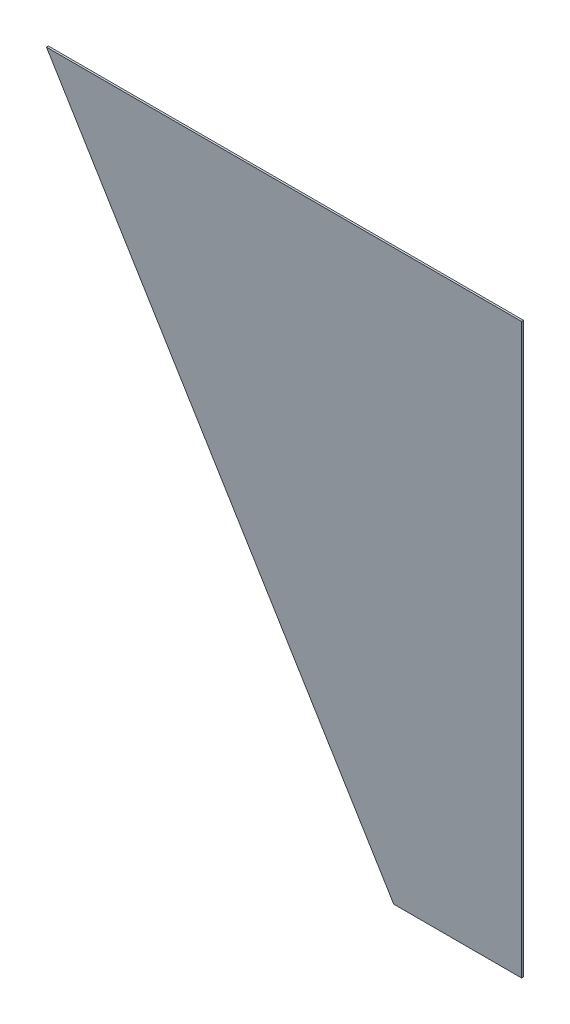
ISO-10303-21;
HEADER;
FILE_DESCRIPTION(('STEP AP214'),'2;1');
FILE_NAME('part.step','',(''),(''),'','','');
FILE_SCHEMA(('AUTOMOTIVE_DESIGN { 1 0 10303 214 1 1 1 1 }'));
ENDSEC;
DATA;
#1=APPLICATION_CONTEXT('core data for automotive mechanical design processes');
#2=APPLICATION_PROTOCOL_DEFINITION('international standard','automotive_design',2000,#1);
#3=PRODUCT_CONTEXT('',#1,'mechanical');
#4=PRODUCT('Part','Part','',(#3));
#5=PRODUCT_RELATED_PRODUCT_CATEGORY('part','',(#4));
#6=PRODUCT_DEFINITION_FORMATION('','',#4);
#7=PRODUCT_DEFINITION_CONTEXT('part definition',#1,'design');
#8=PRODUCT_DEFINITION('design','',#6,#7);
#9=PRODUCT_DEFINITION_SHAPE('','',#8);
#10=(LENGTH_UNIT() NAMED_UNIT(*) SI_UNIT(.MILLI.,.METRE.));
#11=(NAMED_UNIT(*) PLANE_ANGLE_UNIT() SI_UNIT($,.RADIAN.));
#12=(NAMED_UNIT(*) SI_UNIT($,.STERADIAN.) SOLID_ANGLE_UNIT());
#13=UNCERTAINTY_MEASURE_WITH_UNIT(LENGTH_MEASURE(1.E-05),#10,'distance_accuracy_value','');
#14=(GEOMETRIC_REPRESENTATION_CONTEXT(3) GLOBAL_UNCERTAINTY_ASSIGNED_CONTEXT((#13)) GLOBAL_UNIT_ASSIGNED_CONTEXT((#10,
#11,#12)) REPRESENTATION_CONTEXT('',''));
#15=CARTESIAN_POINT('',(0.,0.,0.));
#16=DIRECTION('',(0.,0.,1.));
#17=DIRECTION('',(1.,0.,0.));
#18=AXIS2_PLACEMENT_3D('',#15,#16,#17);
#19=CARTESIAN_POINT('',(0.,-6.16465834193122,26.3522208242994));
#20=DIRECTION('',(0.,0.227783482106071,-0.973711808123755));
#21=DIRECTION('',(0.,0.973711808123755,0.227783482106071));
#22=AXIS2_PLACEMENT_3D('',#19,#20,#21);
#23=PLANE('',#22);
#24=DIRECTION('',(0.,-0.973711808123755,-0.227783482106071));
#25=VECTOR('',#24,1.);
#26=CARTESIAN_POINT('',(32.5,-4.11365960757952,26.8320174433894));
#27=LINE('',#26,#25);
#28=CARTESIAN_POINT('',(32.5,20.1154086838659,32.5));
#29=VERTEX_POINT('',#28);
#30=CARTESIAN_POINT('',(32.5,20.,32.4730020816663));
#31=VERTEX_POINT('',#30);
#32=EDGE_CURVE('E107',#29,#31,#27,.T.);
#33=ORIENTED_EDGE('',*,*,#32,.F.);
#34=DIRECTION('',(1.,0.,0.));
#35=VECTOR('',#34,1.);
#36=CARTESIAN_POINT('',(33.5,20.1154086838659,32.5));
#37=LINE('',#36,#35);
#38=CARTESIAN_POINT('',(-32.5,20.1154086838659,32.5));
#39=VERTEX_POINT('',#38);
#40=EDGE_CURVE('E97',#39,#29,#37,.T.);
#41=ORIENTED_EDGE('',*,*,#40,.F.);
#42=DIRECTION('',(0.,0.973711808123755,0.227783482106071));
#43=VECTOR('',#42,1.);
#44=CARTESIAN_POINT('',(-32.5,10.7466366293097,30.308333529654));
#45=LINE('',#44,#43);
#46=CARTESIAN_POINT('',(-32.5,20.,32.4730020816663));
#47=VERTEX_POINT('',#46);
#48=EDGE_CURVE('E51',#47,#39,#45,.T.);
#49=ORIENTED_EDGE('',*,*,#48,.F.);
#50=DIRECTION('',(-1.,0.,0.));
#51=VECTOR('',#50,1.);
#52=CARTESIAN_POINT('',(0.,20.,32.4730020816663));
#53=LINE('',#52,#51);
#54=CARTESIAN_POINT('',(-33.5,20.,32.4730020816663));
#55=VERTEX_POINT('',#54);
#56=EDGE_CURVE('E119',#47,#55,#53,.T.);
#57=ORIENTED_EDGE('',*,*,#56,.T.);
#58=DIRECTION('',(-0.222094616583597,0.949393470890321,0.222094616583597));
#59=VECTOR('',#58,1.);
#60=CARTESIAN_POINT('',(-26.0287108865205,-11.9377084081706,25.0017129681868));
#61=LINE('',#60,#59);
#62=CARTESIAN_POINT('',(-124.5,409.,123.473002081666));
#63=VERTEX_POINT('',#62);
#64=EDGE_CURVE('E326',#55,#63,#61,.T.);
#65=ORIENTED_EDGE('',*,*,#64,.T.);
#66=DIRECTION('',(1.,0.,0.));
#67=VECTOR('',#66,1.);
#68=CARTESIAN_POINT('',(0.,409.,123.473002081666));
#69=LINE('',#68,#67);
#70=CARTESIAN_POINT('',(124.5,409.,123.473002081666));
#71=VERTEX_POINT('',#70);
#72=EDGE_CURVE('E103',#63,#71,#69,.T.);
#73=ORIENTED_EDGE('',*,*,#72,.T.);
#74=DIRECTION('',(-0.222094616583597,-0.949393470890321,-0.222094616583597));
#75=VECTOR('',#74,1.);
#76=CARTESIAN_POINT('',(26.0287108865205,-11.9377084081706,25.0017129681868));
#77=LINE('',#76,#75);
#78=CARTESIAN_POINT('',(33.5,20.,32.4730020816664));
#79=VERTEX_POINT('',#78);
#80=EDGE_CURVE('E323',#71,#79,#77,.T.);
#81=ORIENTED_EDGE('',*,*,#80,.T.);
#82=EDGE_CURVE('E115',#79,#31,#53,.T.);
#83=ORIENTED_EDGE('',*,*,#82,.T.);
#84=EDGE_LOOP('',(#33,#41,#49,#57,#65,#73,#81,#83));
#85=FACE_BOUND('',#84,.T.);
#86=ADVANCED_FACE('F33',(#85),#23,.T.);
#87=CARTESIAN_POINT('',(32.5,10.,-33.5));
#88=DIRECTION('',(-1.,0.,0.));
#89=DIRECTION('',(0.,0.,1.));
#90=AXIS2_PLACEMENT_3D('',#87,#88,#89);
#91=PLANE('',#90);
#92=DIRECTION('',(0.,1.,0.));
#93=VECTOR('',#92,1.);
#94=CARTESIAN_POINT('',(32.5,10.,32.5));
#95=LINE('',#94,#93);
#96=CARTESIAN_POINT('',(32.5,20.,32.5));
#97=VERTEX_POINT('',#96);
#98=EDGE_CURVE('E43',#97,#29,#95,.T.);
#99=ORIENTED_EDGE('',*,*,#98,.T.);
#100=ORIENTED_EDGE('',*,*,#32,.T.);
#101=DIRECTION('',(0.,0.,-1.));
#102=VECTOR('',#101,1.);
#103=CARTESIAN_POINT('',(32.5,20.,-33.5));
#104=LINE('',#103,#102);
#105=EDGE_CURVE('E110',#97,#31,#104,.T.);
#106=ORIENTED_EDGE('',*,*,#105,.F.);
#107=EDGE_LOOP('',(#99,#100,#106));
#108=FACE_BOUND('',#107,.T.);
#109=ADVANCED_FACE('F106',(#108),#91,.T.);
#110=CARTESIAN_POINT('',(33.5,10.,32.5));
#111=DIRECTION('',(0.,0.,-1.));
#112=DIRECTION('',(-1.,0.,0.));
#113=AXIS2_PLACEMENT_3D('',#110,#111,#112);
#114=PLANE('',#113);
#115=DIRECTION('',(1.,0.,0.));
#116=VECTOR('',#115,1.);
#117=CARTESIAN_POINT('',(33.5,20.,32.5));
#118=LINE('',#117,#116);
#119=CARTESIAN_POINT('',(-32.5,20.,32.5));
#120=VERTEX_POINT('',#119);
#121=EDGE_CURVE('E123',#120,#97,#118,.T.);
#122=ORIENTED_EDGE('',*,*,#121,.F.);
#123=DIRECTION('',(0.,1.,0.));
#124=VECTOR('',#123,1.);
#125=CARTESIAN_POINT('',(-32.5,10.,32.5));
#126=LINE('',#125,#124);
#127=EDGE_CURVE('E11',#120,#39,#126,.T.);
#128=ORIENTED_EDGE('',*,*,#127,.T.);
#129=ORIENTED_EDGE('',*,*,#40,.T.);
#130=ORIENTED_EDGE('',*,*,#98,.F.);
#131=EDGE_LOOP('',(#122,#128,#129,#130));
#132=FACE_BOUND('',#131,.T.);
#133=ADVANCED_FACE('F100',(#132),#114,.T.);
#134=CARTESIAN_POINT('',(0.,20.,0.));
#135=DIRECTION('',(0.,1.,0.));
#136=DIRECTION('',(0.,0.,1.));
#137=AXIS2_PLACEMENT_3D('',#134,#135,#136);
#138=PLANE('',#137);
#139=ORIENTED_EDGE('',*,*,#82,.F.);
#140=DIRECTION('',(0.,0.,-1.));
#141=VECTOR('',#140,1.);
#142=CARTESIAN_POINT('',(33.5,20.,33.5));
#143=LINE('',#142,#141);
#144=CARTESIAN_POINT('',(33.5,20.,33.5));
#145=VERTEX_POINT('',#144);
#146=EDGE_CURVE('E185',#145,#79,#143,.T.);
#147=ORIENTED_EDGE('',*,*,#146,.F.);
#148=DIRECTION('',(1.,0.,0.));
#149=VECTOR('',#148,1.);
#150=CARTESIAN_POINT('',(-33.5,20.,33.5));
#151=LINE('',#150,#149);
#152=CARTESIAN_POINT('',(-33.5,20.,33.5));
#153=VERTEX_POINT('',#152);
#154=EDGE_CURVE('E58',#153,#145,#151,.T.);
#155=ORIENTED_EDGE('',*,*,#154,.F.);
#156=DIRECTION('',(0.,0.,1.));
#157=VECTOR('',#156,1.);
#158=CARTESIAN_POINT('',(-33.5,20.,33.5));
#159=LINE('',#158,#157);
#160=EDGE_CURVE('E180',#55,#153,#159,.T.);
#161=ORIENTED_EDGE('',*,*,#160,.F.);
#162=ORIENTED_EDGE('',*,*,#56,.F.);
#163=DIRECTION('',(0.,0.,1.));
#164=VECTOR('',#163,1.);
#165=CARTESIAN_POINT('',(-32.5,20.,33.5));
#166=LINE('',#165,#164);
#167=EDGE_CURVE('E117',#47,#120,#166,.T.);
#168=ORIENTED_EDGE('',*,*,#167,.T.);
#169=ORIENTED_EDGE('',*,*,#121,.T.);
#170=ORIENTED_EDGE('',*,*,#105,.T.);
#171=EDGE_LOOP('',(#139,#147,#155,#161,#162,#168,#169,#170));
#172=FACE_BOUND('',#171,.T.);
#173=ADVANCED_FACE('F146',(#172),#138,.F.);
#174=CARTESIAN_POINT('',(-32.5,10.,33.5));
#175=DIRECTION('',(1.,0.,0.));
#176=DIRECTION('',(0.,0.,-1.));
#177=AXIS2_PLACEMENT_3D('',#174,#175,#176);
#178=PLANE('',#177);
#179=ORIENTED_EDGE('',*,*,#167,.F.);
#180=ORIENTED_EDGE('',*,*,#48,.T.);
#181=ORIENTED_EDGE('',*,*,#127,.F.);
#182=EDGE_LOOP('',(#179,#180,#181));
#183=FACE_BOUND('',#182,.T.);
#184=ADVANCED_FACE('F239',(#183),#178,.T.);
#185=CARTESIAN_POINT('',(0.,-6.39244182403729,27.3259326324231));
#186=DIRECTION('',(0.,0.227783482106071,-0.973711808123755));
#187=DIRECTION('',(0.,0.973711808123755,0.227783482106071));
#188=AXIS2_PLACEMENT_3D('',#185,#186,#187);
#189=PLANE('',#188);
#190=DIRECTION('',(0.222094616583597,0.949393470890321,0.222094616583597));
#191=VECTOR('',#190,1.);
#192=CARTESIAN_POINT('',(33.5,20.,33.5));
#193=LINE('',#192,#191);
#194=CARTESIAN_POINT('',(124.5,409.,124.5));
#195=VERTEX_POINT('',#194);
#196=EDGE_CURVE('E181',#145,#195,#193,.T.);
#197=ORIENTED_EDGE('',*,*,#196,.T.);
#198=DIRECTION('',(1.,0.,0.));
#199=VECTOR('',#198,1.);
#200=CARTESIAN_POINT('',(-124.5,409.,124.5));
#201=LINE('',#200,#199);
#202=CARTESIAN_POINT('',(-124.5,409.,124.5));
#203=VERTEX_POINT('',#202);
#204=EDGE_CURVE('E156',#203,#195,#201,.T.);
#205=ORIENTED_EDGE('',*,*,#204,.F.);
#206=DIRECTION('',(-0.222094616583597,0.949393470890321,0.222094616583597));
#207=VECTOR('',#206,1.);
#208=CARTESIAN_POINT('',(-33.5,20.,33.5));
#209=LINE('',#208,#207);
#210=EDGE_CURVE('E245',#153,#203,#209,.T.);
#211=ORIENTED_EDGE('',*,*,#210,.F.);
#212=ORIENTED_EDGE('',*,*,#154,.T.);
#213=EDGE_LOOP('',(#197,#205,#211,#212));
#214=FACE_BOUND('',#213,.T.);
#215=ADVANCED_FACE('F236',(#214),#189,.F.);
#216=CARTESIAN_POINT('',(-27.3259326324231,-6.39244182403729,0.));
#217=DIRECTION('',(0.973711808123755,0.227783482106071,0.));
#218=DIRECTION('',(-0.227783482106071,0.973711808123755,0.));
#219=AXIS2_PLACEMENT_3D('',#216,#217,#218);
#220=PLANE('',#219);
#221=ORIENTED_EDGE('',*,*,#64,.F.);
#222=ORIENTED_EDGE('',*,*,#160,.T.);
#223=ORIENTED_EDGE('',*,*,#210,.T.);
#224=DIRECTION('',(0.,0.,1.));
#225=VECTOR('',#224,1.);
#226=CARTESIAN_POINT('',(-124.5,409.,-124.5));
#227=LINE('',#226,#225);
#228=EDGE_CURVE('E219',#63,#203,#227,.T.);
#229=ORIENTED_EDGE('',*,*,#228,.F.);
#230=EDGE_LOOP('',(#221,#222,#223,#229));
#231=FACE_BOUND('',#230,.T.);
#232=ADVANCED_FACE('F227',(#231),#220,.F.);
#233=CARTESIAN_POINT('',(27.3259326324231,-6.39244182403729,0.));
#234=DIRECTION('',(-0.973711808123755,0.227783482106071,0.));
#235=DIRECTION('',(-0.227783482106071,-0.973711808123755,0.));
#236=AXIS2_PLACEMENT_3D('',#233,#234,#235);
#237=PLANE('',#236);
#238=ORIENTED_EDGE('',*,*,#80,.F.);
#239=DIRECTION('',(0.,0.,-1.));
#240=VECTOR('',#239,1.);
#241=CARTESIAN_POINT('',(124.5,409.,124.5));
#242=LINE('',#241,#240);
#243=EDGE_CURVE('E125',#195,#71,#242,.T.);
#244=ORIENTED_EDGE('',*,*,#243,.F.);
#245=ORIENTED_EDGE('',*,*,#196,.F.);
#246=ORIENTED_EDGE('',*,*,#146,.T.);
#247=EDGE_LOOP('',(#238,#244,#245,#246));
#248=FACE_BOUND('',#247,.T.);
#249=ADVANCED_FACE('F35',(#248),#237,.F.);
#250=CARTESIAN_POINT('',(0.,409.,0.));
#251=DIRECTION('',(0.,1.,0.));
#252=DIRECTION('',(0.,0.,1.));
#253=AXIS2_PLACEMENT_3D('',#250,#251,#252);
#254=PLANE('',#253);
#255=ORIENTED_EDGE('',*,*,#243,.T.);
#256=ORIENTED_EDGE('',*,*,#72,.F.);
#257=ORIENTED_EDGE('',*,*,#228,.T.);
#258=ORIENTED_EDGE('',*,*,#204,.T.);
#259=EDGE_LOOP('',(#255,#256,#257,#258));
#260=FACE_BOUND('',#259,.T.);
#261=ADVANCED_FACE('F134',(#260),#254,.T.);
#262=CLOSED_SHELL('',(#86,#109,#133,#173,#184,#215,#232,#249,#261));
#263=MANIFOLD_SOLID_BREP('B2',#262);
#264=ADVANCED_BREP_SHAPE_REPRESENTATION('',(#18,#263),#14);
#265=SHAPE_DEFINITION_REPRESENTATION(#9,#264);
ENDSEC;
END-ISO-10303-21;
